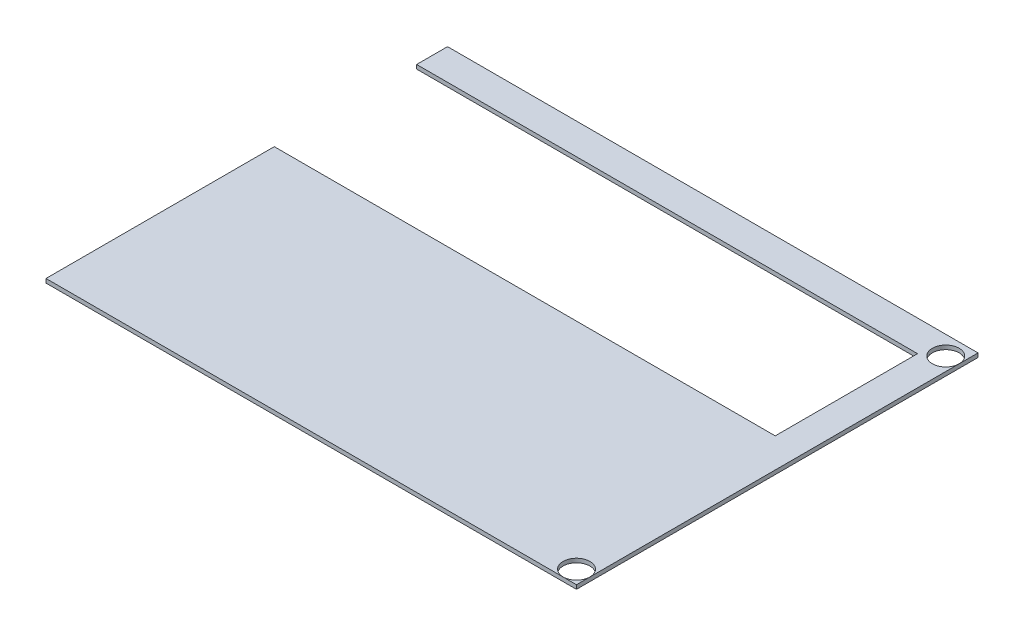
ISO-10303-21;
HEADER;
FILE_DESCRIPTION(('STEP AP214'),'2;1');
FILE_NAME('part.step','',(''),(''),'','','');
FILE_SCHEMA(('AUTOMOTIVE_DESIGN { 1 0 10303 214 1 1 1 1 }'));
ENDSEC;
DATA;
#1=APPLICATION_CONTEXT('core data for automotive mechanical design processes');
#2=APPLICATION_PROTOCOL_DEFINITION('international standard','automotive_design',2000,#1);
#3=PRODUCT_CONTEXT('',#1,'mechanical');
#4=PRODUCT('Part','Part','',(#3));
#5=PRODUCT_RELATED_PRODUCT_CATEGORY('part','',(#4));
#6=PRODUCT_DEFINITION_FORMATION('','',#4);
#7=PRODUCT_DEFINITION_CONTEXT('part definition',#1,'design');
#8=PRODUCT_DEFINITION('design','',#6,#7);
#9=PRODUCT_DEFINITION_SHAPE('','',#8);
#10=(LENGTH_UNIT() NAMED_UNIT(*) SI_UNIT(.MILLI.,.METRE.));
#11=(NAMED_UNIT(*) PLANE_ANGLE_UNIT() SI_UNIT($,.RADIAN.));
#12=(NAMED_UNIT(*) SI_UNIT($,.STERADIAN.) SOLID_ANGLE_UNIT());
#13=UNCERTAINTY_MEASURE_WITH_UNIT(LENGTH_MEASURE(1.E-05),#10,'distance_accuracy_value','');
#14=(GEOMETRIC_REPRESENTATION_CONTEXT(3) GLOBAL_UNCERTAINTY_ASSIGNED_CONTEXT((#13)) GLOBAL_UNIT_ASSIGNED_CONTEXT((#10,
#11,#12)) REPRESENTATION_CONTEXT('',''));
#15=CARTESIAN_POINT('',(0.,0.,0.));
#16=DIRECTION('',(0.,0.,1.));
#17=DIRECTION('',(1.,0.,0.));
#18=AXIS2_PLACEMENT_3D('',#15,#16,#17);
#19=CARTESIAN_POINT('',(5.05824358322216E-13,-0.0100000003674049,-299.));
#20=DIRECTION('',(-1.,-6.22399701222243E-13,0.));
#21=DIRECTION('',(6.22399701222243E-13,-1.,0.));
#22=AXIS2_PLACEMENT_3D('',#19,#20,#21);
#23=PLANE('',#22);
#24=DIRECTION('',(0.,0.,-1.));
#25=VECTOR('',#24,1.);
#26=CARTESIAN_POINT('',(4.99600361003919E-13,1.24359290226694E-10,0.));
#27=LINE('',#26,#25);
#28=CARTESIAN_POINT('',(-4.60927303269633E-13,1.24359290226694E-10,-276.));
#29=VERTEX_POINT('',#28);
#30=CARTESIAN_POINT('',(4.99600361003919E-13,1.24359290226694E-10,-299.));
#31=VERTEX_POINT('',#30);
#32=EDGE_CURVE('E123',#29,#31,#27,.T.);
#33=ORIENTED_EDGE('',*,*,#32,.F.);
#34=DIRECTION('',(-6.22399701222243E-13,1.,0.));
#35=VECTOR('',#34,1.);
#36=CARTESIAN_POINT('',(4.82947015711943E-12,-6.99999999987564,-276.));
#37=LINE('',#36,#35);
#38=CARTESIAN_POINT('',(-4.44089209850063E-13,3.00000000012436,-276.));
#39=VERTEX_POINT('',#38);
#40=EDGE_CURVE('E130',#29,#39,#37,.T.);
#41=ORIENTED_EDGE('',*,*,#40,.T.);
#42=DIRECTION('',(0.,0.,-1.));
#43=VECTOR('',#42,1.);
#44=CARTESIAN_POINT('',(-1.36759874266281E-12,3.00000000012436,0.));
#45=LINE('',#44,#43);
#46=CARTESIAN_POINT('',(-1.36759874266281E-12,3.00000000012436,-299.));
#47=VERTEX_POINT('',#46);
#48=EDGE_CURVE('E133',#39,#47,#45,.T.);
#49=ORIENTED_EDGE('',*,*,#48,.T.);
#50=DIRECTION('',(6.22399701222243E-13,-1.,0.));
#51=VECTOR('',#50,1.);
#52=CARTESIAN_POINT('',(4.99600361003919E-13,1.24359290226694E-10,-299.));
#53=LINE('',#52,#51);
#54=EDGE_CURVE('E160',#47,#31,#53,.T.);
#55=ORIENTED_EDGE('',*,*,#54,.T.);
#56=EDGE_LOOP('',(#33,#41,#49,#55));
#57=FACE_BOUND('',#56,.T.);
#58=ADVANCED_FACE('F43',(#57),#23,.T.);
#59=CARTESIAN_POINT('',(4.99600361003919E-13,1.24359290226694E-10,0.));
#60=VERTEX_POINT('',#59);
#61=CARTESIAN_POINT('',(-4.60927303341881E-13,1.24359290226694E-10,-170.));
#62=VERTEX_POINT('',#61);
#63=EDGE_CURVE('E116',#60,#62,#27,.T.);
#64=ORIENTED_EDGE('',*,*,#63,.F.);
#65=DIRECTION('',(-6.22399701222243E-13,1.,0.));
#66=VECTOR('',#65,1.);
#67=CARTESIAN_POINT('',(4.99600361003919E-13,1.24359290226694E-10,0.));
#68=LINE('',#67,#66);
#69=CARTESIAN_POINT('',(-1.36759874266281E-12,3.00000000012436,0.));
#70=VERTEX_POINT('',#69);
#71=EDGE_CURVE('E124',#60,#70,#68,.T.);
#72=ORIENTED_EDGE('',*,*,#71,.T.);
#73=CARTESIAN_POINT('',(-5.55111512312578E-13,3.00000000012436,-170.));
#74=VERTEX_POINT('',#73);
#75=EDGE_CURVE('E129',#70,#74,#45,.T.);
#76=ORIENTED_EDGE('',*,*,#75,.T.);
#77=DIRECTION('',(6.22399701222243E-13,-1.,0.));
#78=VECTOR('',#77,1.);
#79=CARTESIAN_POINT('',(4.82947015711943E-12,-6.99999999987564,-170.));
#80=LINE('',#79,#78);
#81=EDGE_CURVE('E108',#74,#62,#80,.T.);
#82=ORIENTED_EDGE('',*,*,#81,.T.);
#83=EDGE_LOOP('',(#64,#72,#76,#82));
#84=FACE_BOUND('',#83,.T.);
#85=ADVANCED_FACE('F127',(#84),#23,.T.);
#86=CARTESIAN_POINT('',(4.44089209850063E-13,1.24359290226694E-10,0.));
#87=DIRECTION('',(0.,0.,-1.));
#88=DIRECTION('',(1.,6.22399701222243E-13,0.));
#89=AXIS2_PLACEMENT_3D('',#86,#87,#88);
#90=PLANE('',#89);
#91=ORIENTED_EDGE('',*,*,#71,.F.);
#92=DIRECTION('',(-1.,-6.22399701222243E-13,0.));
#93=VECTOR('',#92,1.);
#94=CARTESIAN_POINT('',(4.44089209850063E-13,1.24359290226694E-10,0.));
#95=LINE('',#94,#93);
#96=CARTESIAN_POINT('',(395.01,3.70213396206492E-10,0.));
#97=VERTEX_POINT('',#96);
#98=EDGE_CURVE('E119',#97,#60,#95,.T.);
#99=ORIENTED_EDGE('',*,*,#98,.F.);
#100=DIRECTION('',(0.,-1.,0.));
#101=VECTOR('',#100,1.);
#102=CARTESIAN_POINT('',(395.01,3.,0.));
#103=LINE('',#102,#101);
#104=CARTESIAN_POINT('',(395.01,3.00000000037021,0.));
#105=VERTEX_POINT('',#104);
#106=EDGE_CURVE('E144',#105,#97,#103,.T.);
#107=ORIENTED_EDGE('',*,*,#106,.F.);
#108=DIRECTION('',(-1.,-6.22399701222243E-13,0.));
#109=VECTOR('',#108,1.);
#110=CARTESIAN_POINT('',(-1.4432899320127E-12,3.00000000012436,0.));
#111=LINE('',#110,#109);
#112=EDGE_CURVE('E142',#105,#70,#111,.T.);
#113=ORIENTED_EDGE('',*,*,#112,.T.);
#114=EDGE_LOOP('',(#91,#99,#107,#113));
#115=FACE_BOUND('',#114,.T.);
#116=ADVANCED_FACE('F209',(#115),#90,.F.);
#117=CARTESIAN_POINT('',(4.9960036108132E-13,1.24359290226694E-10,-299.));
#118=DIRECTION('',(0.,0.,1.));
#119=DIRECTION('',(-1.,-6.22399701222243E-13,0.));
#120=AXIS2_PLACEMENT_3D('',#117,#118,#119);
#121=PLANE('',#120);
#122=ORIENTED_EDGE('',*,*,#54,.F.);
#123=DIRECTION('',(1.,6.22399701222243E-13,0.));
#124=VECTOR('',#123,1.);
#125=CARTESIAN_POINT('',(-1.38777878078145E-12,3.00000000012436,-299.));
#126=LINE('',#125,#124);
#127=CARTESIAN_POINT('',(395.01,3.00000000037021,-299.));
#128=VERTEX_POINT('',#127);
#129=EDGE_CURVE('E140',#47,#128,#126,.T.);
#130=ORIENTED_EDGE('',*,*,#129,.T.);
#131=DIRECTION('',(0.,-1.,0.));
#132=VECTOR('',#131,1.);
#133=CARTESIAN_POINT('',(395.01,3.,-299.));
#134=LINE('',#133,#132);
#135=CARTESIAN_POINT('',(395.01,3.70213396206492E-10,-299.));
#136=VERTEX_POINT('',#135);
#137=EDGE_CURVE('E175',#128,#136,#134,.T.);
#138=ORIENTED_EDGE('',*,*,#137,.T.);
#139=DIRECTION('',(1.,6.22399701222243E-13,0.));
#140=VECTOR('',#139,1.);
#141=CARTESIAN_POINT('',(4.9960036108132E-13,1.24359290226694E-10,-299.));
#142=LINE('',#141,#140);
#143=EDGE_CURVE('E137',#31,#136,#142,.T.);
#144=ORIENTED_EDGE('',*,*,#143,.F.);
#145=EDGE_LOOP('',(#122,#130,#138,#144));
#146=FACE_BOUND('',#145,.T.);
#147=ADVANCED_FACE('F174',(#146),#121,.F.);
#148=CARTESIAN_POINT('',(-373.009999999995,-7.0000000001078,-276.));
#149=DIRECTION('',(0.,0.,-1.));
#150=DIRECTION('',(-1.,0.,0.));
#151=AXIS2_PLACEMENT_3D('',#148,#149,#150);
#152=PLANE('',#151);
#153=ORIENTED_EDGE('',*,*,#40,.F.);
#154=DIRECTION('',(1.,6.22399701222243E-13,0.));
#155=VECTOR('',#154,1.);
#156=CARTESIAN_POINT('',(4.9960036108132E-13,1.24359290226694E-10,-276.));
#157=LINE('',#156,#155);
#158=CARTESIAN_POINT('',(373.010000000002,3.56520368782753E-10,-276.));
#159=VERTEX_POINT('',#158);
#160=EDGE_CURVE('E145',#29,#159,#157,.T.);
#161=ORIENTED_EDGE('',*,*,#160,.T.);
#162=DIRECTION('',(-6.22399701222243E-13,1.,0.));
#163=VECTOR('',#162,1.);
#164=CARTESIAN_POINT('',(373.010000000006,-6.99999999964348,-276.));
#165=LINE('',#164,#163);
#166=CARTESIAN_POINT('',(373.01,3.00000000035652,-276.));
#167=VERTEX_POINT('',#166);
#168=EDGE_CURVE('E64',#159,#167,#165,.T.);
#169=ORIENTED_EDGE('',*,*,#168,.T.);
#170=DIRECTION('',(-1.,-6.22400236553786E-13,0.));
#171=VECTOR('',#170,1.);
#172=CARTESIAN_POINT('',(-373.010000000001,2.9999999998922,-276.));
#173=LINE('',#172,#171);
#174=EDGE_CURVE('E147',#167,#39,#173,.T.);
#175=ORIENTED_EDGE('',*,*,#174,.T.);
#176=EDGE_LOOP('',(#153,#161,#169,#175));
#177=FACE_BOUND('',#176,.T.);
#178=ADVANCED_FACE('F217',(#177),#152,.F.);
#179=CARTESIAN_POINT('',(4.9960036108132E-13,1.24359290226694E-10,0.));
#180=DIRECTION('',(6.22399701222243E-13,-1.,0.));
#181=DIRECTION('',(0.,0.,1.));
#182=AXIS2_PLACEMENT_3D('',#179,#180,#181);
#183=PLANE('',#182);
#184=CARTESIAN_POINT('',(385.,0.,-285.));
#185=DIRECTION('',(0.,1.,0.));
#186=DIRECTION('',(0.,0.,1.));
#187=AXIS2_PLACEMENT_3D('',#184,#185,#186);
#188=CIRCLE('',#187,9.99999999999998);
#189=CARTESIAN_POINT('',(385.,0.,-275.));
#190=VERTEX_POINT('',#189);
#191=EDGE_CURVE('E185',#190,#190,#188,.T.);
#192=ORIENTED_EDGE('',*,*,#191,.T.);
#193=EDGE_LOOP('',(#192));
#194=FACE_BOUND('',#193,.T.);
#195=CARTESIAN_POINT('',(385.,0.,-10.0499999999999));
#196=DIRECTION('',(0.,1.,0.));
#197=DIRECTION('',(0.,0.,1.));
#198=AXIS2_PLACEMENT_3D('',#195,#196,#197);
#199=CIRCLE('',#198,9.99999999999998);
#200=CARTESIAN_POINT('',(385.,0.,-0.0499999999999112));
#201=VERTEX_POINT('',#200);
#202=EDGE_CURVE('E182',#201,#201,#199,.T.);
#203=ORIENTED_EDGE('',*,*,#202,.T.);
#204=EDGE_LOOP('',(#203));
#205=FACE_BOUND('',#204,.T.);
#206=ORIENTED_EDGE('',*,*,#98,.T.);
#207=ORIENTED_EDGE('',*,*,#63,.T.);
#208=DIRECTION('',(-1.,-6.22399701222243E-13,0.));
#209=VECTOR('',#208,1.);
#210=CARTESIAN_POINT('',(4.80625878407973E-13,1.24359290226694E-10,-170.));
#211=LINE('',#210,#209);
#212=CARTESIAN_POINT('',(373.010000000006,3.56520602779607E-10,-170.));
#213=VERTEX_POINT('',#212);
#214=EDGE_CURVE('E104',#213,#62,#211,.T.);
#215=ORIENTED_EDGE('',*,*,#214,.F.);
#216=DIRECTION('',(0.,0.,1.));
#217=VECTOR('',#216,1.);
#218=CARTESIAN_POINT('',(373.010000000002,3.56520602779604E-10,1.95341646422373E-13));
#219=LINE('',#218,#217);
#220=EDGE_CURVE('E113',#159,#213,#219,.T.);
#221=ORIENTED_EDGE('',*,*,#220,.F.);
#222=ORIENTED_EDGE('',*,*,#160,.F.);
#223=ORIENTED_EDGE('',*,*,#32,.T.);
#224=ORIENTED_EDGE('',*,*,#143,.T.);
#225=DIRECTION('',(0.,0.,-1.));
#226=VECTOR('',#225,1.);
#227=CARTESIAN_POINT('',(395.01,0.,-300.));
#228=LINE('',#227,#226);
#229=EDGE_CURVE('E177',#97,#136,#228,.T.);
#230=ORIENTED_EDGE('',*,*,#229,.F.);
#231=EDGE_LOOP('',(#206,#207,#215,#221,#222,#223,#224,#230));
#232=FACE_BOUND('',#231,.T.);
#233=ADVANCED_FACE('F117',(#194,#205,#232),#183,.T.);
#234=CARTESIAN_POINT('',(373.010000000006,-6.99999999964348,-276.));
#235=DIRECTION('',(1.,6.22399701222243E-13,0.));
#236=DIRECTION('',(-6.22399701222243E-13,1.,0.));
#237=AXIS2_PLACEMENT_3D('',#234,#235,#236);
#238=PLANE('',#237);
#239=ORIENTED_EDGE('',*,*,#220,.T.);
#240=DIRECTION('',(-6.22399701222243E-13,1.,0.));
#241=VECTOR('',#240,1.);
#242=CARTESIAN_POINT('',(373.010000000006,-6.99999999964348,-170.));
#243=LINE('',#242,#241);
#244=CARTESIAN_POINT('',(373.01,3.00000000035652,-170.));
#245=VERTEX_POINT('',#244);
#246=EDGE_CURVE('E109',#213,#245,#243,.T.);
#247=ORIENTED_EDGE('',*,*,#246,.T.);
#248=DIRECTION('',(0.,0.,-1.));
#249=VECTOR('',#248,1.);
#250=CARTESIAN_POINT('',(373.01,3.00000000035652,-276.));
#251=LINE('',#250,#249);
#252=EDGE_CURVE('E51',#245,#167,#251,.T.);
#253=ORIENTED_EDGE('',*,*,#252,.T.);
#254=ORIENTED_EDGE('',*,*,#168,.F.);
#255=EDGE_LOOP('',(#239,#247,#253,#254));
#256=FACE_BOUND('',#255,.T.);
#257=ADVANCED_FACE('F222',(#256),#238,.F.);
#258=CARTESIAN_POINT('',(-373.009999999995,-7.0000000001078,-170.));
#259=DIRECTION('',(0.,0.,1.));
#260=DIRECTION('',(1.,0.,0.));
#261=AXIS2_PLACEMENT_3D('',#258,#259,#260);
#262=PLANE('',#261);
#263=ORIENTED_EDGE('',*,*,#81,.F.);
#264=DIRECTION('',(1.,6.22400236553786E-13,0.));
#265=VECTOR('',#264,1.);
#266=CARTESIAN_POINT('',(-373.010000000001,2.9999999998922,-170.));
#267=LINE('',#266,#265);
#268=EDGE_CURVE('E13',#74,#245,#267,.T.);
#269=ORIENTED_EDGE('',*,*,#268,.T.);
#270=ORIENTED_EDGE('',*,*,#246,.F.);
#271=ORIENTED_EDGE('',*,*,#214,.T.);
#272=EDGE_LOOP('',(#263,#269,#270,#271));
#273=FACE_BOUND('',#272,.T.);
#274=ADVANCED_FACE('F106',(#273),#262,.F.);
#275=CARTESIAN_POINT('',(385.,-7.,-10.0499999999999));
#276=DIRECTION('',(0.,1.,0.));
#277=DIRECTION('',(0.,0.,1.));
#278=AXIS2_PLACEMENT_3D('',#275,#276,#277);
#279=CYLINDRICAL_SURFACE('',#278,9.99999999999998);
#280=CARTESIAN_POINT('',(385.,3.,-10.0499999999999));
#281=DIRECTION('',(0.,1.,0.));
#282=DIRECTION('',(0.,0.,1.));
#283=AXIS2_PLACEMENT_3D('',#280,#281,#282);
#284=CIRCLE('',#283,9.99999999999998);
#285=CARTESIAN_POINT('',(385.,3.,-0.0499999999999112));
#286=VERTEX_POINT('',#285);
#287=EDGE_CURVE('E192',#286,#286,#284,.T.);
#288=ORIENTED_EDGE('',*,*,#287,.T.);
#289=EDGE_LOOP('',(#288));
#290=FACE_BOUND('',#289,.T.);
#291=ORIENTED_EDGE('',*,*,#202,.F.);
#292=EDGE_LOOP('',(#291));
#293=FACE_BOUND('',#292,.T.);
#294=ADVANCED_FACE('F197',(#290,#293),#279,.F.);
#295=CARTESIAN_POINT('',(385.,-7.,-285.));
#296=DIRECTION('',(0.,1.,0.));
#297=DIRECTION('',(0.,0.,1.));
#298=AXIS2_PLACEMENT_3D('',#295,#296,#297);
#299=CYLINDRICAL_SURFACE('',#298,9.99999999999998);
#300=CARTESIAN_POINT('',(385.,3.,-285.));
#301=DIRECTION('',(0.,1.,0.));
#302=DIRECTION('',(0.,0.,1.));
#303=AXIS2_PLACEMENT_3D('',#300,#301,#302);
#304=CIRCLE('',#303,9.99999999999998);
#305=CARTESIAN_POINT('',(385.,3.,-275.));
#306=VERTEX_POINT('',#305);
#307=EDGE_CURVE('E146',#306,#306,#304,.T.);
#308=ORIENTED_EDGE('',*,*,#307,.T.);
#309=EDGE_LOOP('',(#308));
#310=FACE_BOUND('',#309,.T.);
#311=ORIENTED_EDGE('',*,*,#191,.F.);
#312=EDGE_LOOP('',(#311));
#313=FACE_BOUND('',#312,.T.);
#314=ADVANCED_FACE('F205',(#310,#313),#299,.F.);
#315=CARTESIAN_POINT('',(395.01,3.,-300.));
#316=DIRECTION('',(-1.,0.,0.));
#317=DIRECTION('',(0.,0.,1.));
#318=AXIS2_PLACEMENT_3D('',#315,#316,#317);
#319=PLANE('',#318);
#320=ORIENTED_EDGE('',*,*,#229,.T.);
#321=ORIENTED_EDGE('',*,*,#137,.F.);
#322=DIRECTION('',(0.,0.,-1.));
#323=VECTOR('',#322,1.);
#324=CARTESIAN_POINT('',(395.01,3.,-300.));
#325=LINE('',#324,#323);
#326=EDGE_CURVE('E170',#105,#128,#325,.T.);
#327=ORIENTED_EDGE('',*,*,#326,.F.);
#328=ORIENTED_EDGE('',*,*,#106,.T.);
#329=EDGE_LOOP('',(#320,#321,#327,#328));
#330=FACE_BOUND('',#329,.T.);
#331=ADVANCED_FACE('F180',(#330),#319,.F.);
#332=CARTESIAN_POINT('',(-1.38777878078145E-12,3.00000000012436,0.));
#333=DIRECTION('',(6.22399701222243E-13,-1.,0.));
#334=DIRECTION('',(0.,0.,1.));
#335=AXIS2_PLACEMENT_3D('',#332,#333,#334);
#336=PLANE('',#335);
#337=ORIENTED_EDGE('',*,*,#307,.F.);
#338=EDGE_LOOP('',(#337));
#339=FACE_BOUND('',#338,.T.);
#340=ORIENTED_EDGE('',*,*,#287,.F.);
#341=EDGE_LOOP('',(#340));
#342=FACE_BOUND('',#341,.T.);
#343=ORIENTED_EDGE('',*,*,#75,.F.);
#344=ORIENTED_EDGE('',*,*,#112,.F.);
#345=ORIENTED_EDGE('',*,*,#326,.T.);
#346=ORIENTED_EDGE('',*,*,#129,.F.);
#347=ORIENTED_EDGE('',*,*,#48,.F.);
#348=ORIENTED_EDGE('',*,*,#174,.F.);
#349=ORIENTED_EDGE('',*,*,#252,.F.);
#350=ORIENTED_EDGE('',*,*,#268,.F.);
#351=EDGE_LOOP('',(#343,#344,#345,#346,#347,#348,#349,#350));
#352=FACE_BOUND('',#351,.T.);
#353=ADVANCED_FACE('F45',(#339,#342,#352),#336,.F.);
#354=CLOSED_SHELL('',(#58,#85,#116,#147,#178,#233,#257,#274,#294,#314,#331,#353));
#355=MANIFOLD_SOLID_BREP('B2',#354);
#356=ADVANCED_BREP_SHAPE_REPRESENTATION('',(#18,#355),#14);
#357=SHAPE_DEFINITION_REPRESENTATION(#9,#356);
ENDSEC;
END-ISO-10303-21;
